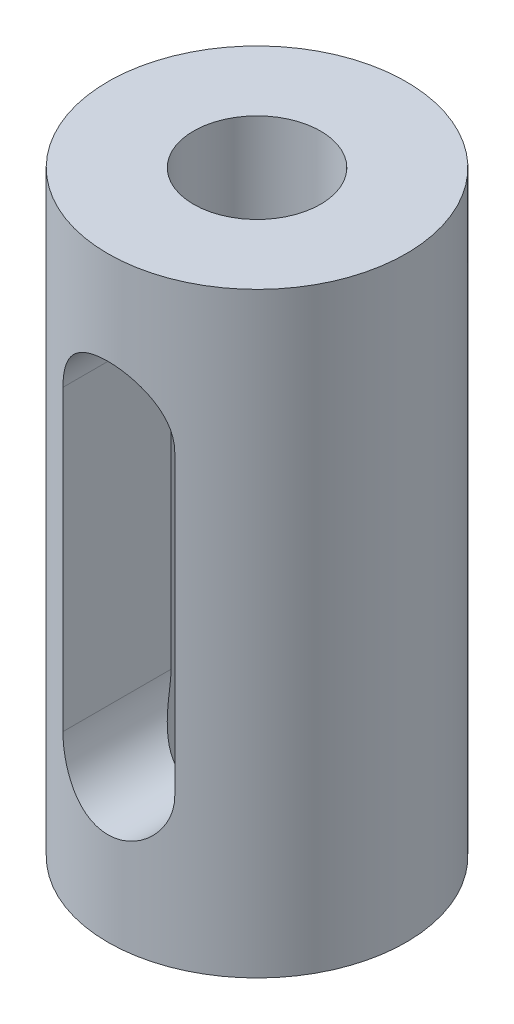
ISO-10303-21;
HEADER;
FILE_DESCRIPTION(('STEP AP214'),'2;1');
FILE_NAME('part.step','',(''),(''),'','','');
FILE_SCHEMA(('AUTOMOTIVE_DESIGN { 1 0 10303 214 1 1 1 1 }'));
ENDSEC;
DATA;
#1=APPLICATION_CONTEXT('core data for automotive mechanical design processes');
#2=APPLICATION_PROTOCOL_DEFINITION('international standard','automotive_design',2000,#1);
#3=PRODUCT_CONTEXT('',#1,'mechanical');
#4=PRODUCT('Part','Part','',(#3));
#5=PRODUCT_RELATED_PRODUCT_CATEGORY('part','',(#4));
#6=PRODUCT_DEFINITION_FORMATION('','',#4);
#7=PRODUCT_DEFINITION_CONTEXT('part definition',#1,'design');
#8=PRODUCT_DEFINITION('design','',#6,#7);
#9=PRODUCT_DEFINITION_SHAPE('','',#8);
#10=(LENGTH_UNIT() NAMED_UNIT(*) SI_UNIT(.MILLI.,.METRE.));
#11=(NAMED_UNIT(*) PLANE_ANGLE_UNIT() SI_UNIT($,.RADIAN.));
#12=(NAMED_UNIT(*) SI_UNIT($,.STERADIAN.) SOLID_ANGLE_UNIT());
#13=UNCERTAINTY_MEASURE_WITH_UNIT(LENGTH_MEASURE(1.E-05),#10,'distance_accuracy_value','');
#14=(GEOMETRIC_REPRESENTATION_CONTEXT(3) GLOBAL_UNCERTAINTY_ASSIGNED_CONTEXT((#13)) GLOBAL_UNIT_ASSIGNED_CONTEXT((#10,
#11,#12)) REPRESENTATION_CONTEXT('',''));
#15=CARTESIAN_POINT('',(0.,0.,0.));
#16=DIRECTION('',(0.,0.,1.));
#17=DIRECTION('',(1.,0.,0.));
#18=AXIS2_PLACEMENT_3D('',#15,#16,#17);
#19=CARTESIAN_POINT('',(0.,12.7,0.));
#20=DIRECTION('',(0.,-1.,0.));
#21=DIRECTION('',(0.,0.,-1.));
#22=AXIS2_PLACEMENT_3D('',#19,#20,#21);
#23=CYLINDRICAL_SURFACE('',#22,3.175);
#24=DIRECTION('',(0.,-1.,0.));
#25=VECTOR('',#24,1.);
#26=CARTESIAN_POINT('',(-1.190625,12.7,-2.94330377456609));
#27=LINE('',#26,#25);
#28=CARTESIAN_POINT('',(-1.190625,9.525,-2.94330377456609));
#29=VERTEX_POINT('',#28);
#30=CARTESIAN_POINT('',(-1.190625,3.175,-2.94330377456609));
#31=VERTEX_POINT('',#30);
#32=EDGE_CURVE('E166',#29,#31,#27,.T.);
#33=ORIENTED_EDGE('',*,*,#32,.T.);
#34=CARTESIAN_POINT('',(-1.190625,3.175,-2.94330377456609));
#35=CARTESIAN_POINT('',(-1.19062618848073,3.14277967690778,-2.94329995872857));
#36=CARTESIAN_POINT('',(-1.18931625076439,3.11057613112784,-2.94383351554502));
#37=CARTESIAN_POINT('',(-1.18409962328059,3.04642477238517,-2.94593703117006));
#38=CARTESIAN_POINT('',(-1.18019380538843,3.01447687720228,-2.94750664199916));
#39=CARTESIAN_POINT('',(-1.16466526629548,2.91959727251809,-2.95369436887438));
#40=CARTESIAN_POINT('',(-1.14923092772087,2.85734151969469,-2.95979205795841));
#41=CARTESIAN_POINT('',(-1.10879122478177,2.73655828217862,-2.97517516785815));
#42=CARTESIAN_POINT('',(-1.08379392479305,2.67802770444891,-2.98445790207025));
#43=CARTESIAN_POINT('',(-1.02500190069595,2.56592901845132,-3.00515645633822));
#44=CARTESIAN_POINT('',(-0.99119997623926,2.51236502065264,-3.01657402007336));
#45=CARTESIAN_POINT('',(-0.91397616823413,2.40911703854706,-3.04088474426552));
#46=CARTESIAN_POINT('',(-0.870190267274443,2.35971555113495,-3.05382115655563));
#47=CARTESIAN_POINT('',(-0.775013201823314,2.26875689804242,-3.07935139516824));
#48=CARTESIAN_POINT('',(-0.723620568591073,2.22720125080481,-3.09194515477271));
#49=CARTESIAN_POINT('',(-0.612531890043652,2.15174495493618,-3.11588859526652));
#50=CARTESIAN_POINT('',(-0.552612693952159,2.11815314820732,-3.1271813121393));
#51=CARTESIAN_POINT('',(-0.427476937704532,2.06164504557796,-3.14672690537256));
#52=CARTESIAN_POINT('',(-0.362262363264181,2.03872476946978,-3.15498091485232));
#53=CARTESIAN_POINT('',(-0.231370227719777,2.00520481068537,-3.16721085556145));
#54=CARTESIAN_POINT('',(-0.165833940311951,1.99411638870874,-3.17135594220028));
#55=CARTESIAN_POINT('',(-0.0337072593735775,1.98300879914146,-3.17550811124661));
#56=CARTESIAN_POINT('',(0.0328828035241819,1.98298622578848,-3.17551646682561));
#57=CARTESIAN_POINT('',(0.161721879430094,1.99372680869424,-3.17150165938149));
#58=CARTESIAN_POINT('',(0.224022668288449,2.00395639594589,-3.16767793539666));
#59=CARTESIAN_POINT('',(0.345948219071124,2.03401316519528,-3.15669026926481));
#60=CARTESIAN_POINT('',(0.405572828828377,2.05384089218802,-3.14952613744589));
#61=CARTESIAN_POINT('',(0.521484953024784,2.10277899912289,-3.13243730414583));
#62=CARTESIAN_POINT('',(0.577711250922169,2.13202031123296,-3.12247393335648));
#63=CARTESIAN_POINT('',(0.684598615222709,2.19883992982367,-3.10079480626558));
#64=CARTESIAN_POINT('',(0.735257863666696,2.23642094766869,-3.08907848045636));
#65=CARTESIAN_POINT('',(0.832712013169233,2.32141961062108,-3.06429285419527));
#66=CARTESIAN_POINT('',(0.879108122886126,2.36928373006591,-3.05118449980405));
#67=CARTESIAN_POINT('',(0.963372193449839,2.47220115666236,-3.02563755595115));
#68=CARTESIAN_POINT('',(1.00123680232957,2.5272572761264,-3.01319923119479));
#69=CARTESIAN_POINT('',(1.06813348661141,2.64458293505346,-2.99015045178193));
#70=CARTESIAN_POINT('',(1.09694552938089,2.70698785949868,-2.97958790430647));
#71=CARTESIAN_POINT('',(1.14346922163723,2.836232517962,-2.96204837787692));
#72=CARTESIAN_POINT('',(1.16119952777849,2.90306458766553,-2.95506537616461));
#73=CARTESIAN_POINT('',(1.17887172316472,3.00464618275791,-2.94803692564227));
#74=CARTESIAN_POINT('',(1.18327510053614,3.03855622405695,-2.94626884394537));
#75=CARTESIAN_POINT('',(1.18915107766906,3.10663754216694,-2.94390042682448));
#76=CARTESIAN_POINT('',(1.1906264013445,3.1408085464671,-2.94329900608927));
#77=CARTESIAN_POINT('',(1.190625,3.175,-2.94330377456609));
#78=B_SPLINE_CURVE_WITH_KNOTS('',3,(#34,#35,#36,#37,#38,#39,#40,#41,#42,#43,#44,#45,#46,#47,#48,
#49,#50,#51,#52,#53,#54,#55,#56,#57,#58,#59,#60,#61,#62,#63,#64,#65,#66,#67,#68,#69,#70,#71,#72,
#73,#74,#75,#76,#77),.UNSPECIFIED.,.F.,.F.,(4,2,2,2,2,2,2,2,2,2,2,2,2,2,2,2,2,2,2,2,2,4),(0.,
0.0965973633725355,0.193162299084219,0.38543949501938,0.577554901150598,0.769827913629831,
0.970740592641539,1.171692115472,1.37948621931291,1.58720275906571,1.78596071876867,
1.98465750622697,2.17352376479971,2.36240074870515,2.5540273495621,2.74571634263585,
2.94860657699107,3.151576387038,3.35915405166445,3.56638130093289,3.66897446974835,
3.77147215322594),.UNSPECIFIED.);
#79=CARTESIAN_POINT('',(1.190625,3.175,-2.94330377456609));
#80=VERTEX_POINT('',#79);
#81=EDGE_CURVE('E122',#31,#80,#78,.T.);
#82=ORIENTED_EDGE('',*,*,#81,.T.);
#83=DIRECTION('',(0.,-1.,0.));
#84=VECTOR('',#83,1.);
#85=CARTESIAN_POINT('',(1.190625,12.7,-2.94330377456609));
#86=LINE('',#85,#84);
#87=CARTESIAN_POINT('',(1.190625,9.525,-2.94330377456609));
#88=VERTEX_POINT('',#87);
#89=EDGE_CURVE('E172',#80,#88,#86,.F.);
#90=ORIENTED_EDGE('',*,*,#89,.T.);
#91=CARTESIAN_POINT('',(1.190625,9.525,-2.94330377456609));
#92=CARTESIAN_POINT('',(1.19062618848073,9.55722032309222,-2.94329995872857));
#93=CARTESIAN_POINT('',(1.18931625076439,9.58942386887216,-2.94383351554502));
#94=CARTESIAN_POINT('',(1.18409962328059,9.65357522761483,-2.94593703117006));
#95=CARTESIAN_POINT('',(1.18019380538843,9.68552312279772,-2.94750664199916));
#96=CARTESIAN_POINT('',(1.16466526629548,9.7804027274819,-2.95369436887438));
#97=CARTESIAN_POINT('',(1.14923092772087,9.84265848030531,-2.95979205795841));
#98=CARTESIAN_POINT('',(1.10879122478177,9.96344171782138,-2.97517516785815));
#99=CARTESIAN_POINT('',(1.08379392479305,10.0219722955511,-2.98445790207025));
#100=CARTESIAN_POINT('',(1.02500190069595,10.1340709815487,-3.00515645633822));
#101=CARTESIAN_POINT('',(0.99119997623926,10.1876349793474,-3.01657402007336));
#102=CARTESIAN_POINT('',(0.91397616823413,10.2908829614529,-3.04088474426552));
#103=CARTESIAN_POINT('',(0.870190267274443,10.3402844488651,-3.05382115655563));
#104=CARTESIAN_POINT('',(0.775013201823314,10.4312431019576,-3.07935139516824));
#105=CARTESIAN_POINT('',(0.723620568591073,10.4727987491952,-3.09194515477271));
#106=CARTESIAN_POINT('',(0.612531890043652,10.5482550450638,-3.11588859526652));
#107=CARTESIAN_POINT('',(0.55261269395216,10.5818468517927,-3.1271813121393));
#108=CARTESIAN_POINT('',(0.427476937704532,10.638354954422,-3.14672690537256));
#109=CARTESIAN_POINT('',(0.362262363264181,10.6612752305302,-3.15498091485232));
#110=CARTESIAN_POINT('',(0.231370227719777,10.6947951893146,-3.16721085556145));
#111=CARTESIAN_POINT('',(0.165833940311951,10.7058836112913,-3.17135594220028));
#112=CARTESIAN_POINT('',(0.0337072593735779,10.7169912008585,-3.17550811124661));
#113=CARTESIAN_POINT('',(-0.0328828035241814,10.7170137742115,-3.17551646682561));
#114=CARTESIAN_POINT('',(-0.161721879430094,10.7062731913058,-3.17150165938149));
#115=CARTESIAN_POINT('',(-0.224022668288449,10.6960436040541,-3.16767793539666));
#116=CARTESIAN_POINT('',(-0.345948219071124,10.6659868348047,-3.15669026926481));
#117=CARTESIAN_POINT('',(-0.405572828828377,10.646159107812,-3.14952613744589));
#118=CARTESIAN_POINT('',(-0.521484953024784,10.5972210008771,-3.13243730414583));
#119=CARTESIAN_POINT('',(-0.577711250922168,10.567979688767,-3.12247393335648));
#120=CARTESIAN_POINT('',(-0.684598615222709,10.5011600701763,-3.10079480626558));
#121=CARTESIAN_POINT('',(-0.735257863666696,10.4635790523313,-3.08907848045636));
#122=CARTESIAN_POINT('',(-0.832712013169232,10.3785803893789,-3.06429285419527));
#123=CARTESIAN_POINT('',(-0.879108122886125,10.3307162699341,-3.05118449980405));
#124=CARTESIAN_POINT('',(-0.963372193449838,10.2277988433376,-3.02563755595115));
#125=CARTESIAN_POINT('',(-1.00123680232957,10.1727427238736,-3.01319923119479));
#126=CARTESIAN_POINT('',(-1.06813348661141,10.0554170649465,-2.99015045178193));
#127=CARTESIAN_POINT('',(-1.09694552938089,9.99301214050132,-2.97958790430647));
#128=CARTESIAN_POINT('',(-1.14346922163723,9.86376748203799,-2.96204837787692));
#129=CARTESIAN_POINT('',(-1.16119952777849,9.79693541233447,-2.95506537616461));
#130=CARTESIAN_POINT('',(-1.17887172316472,9.69535381724209,-2.94803692564227));
#131=CARTESIAN_POINT('',(-1.18327510053614,9.66144377594305,-2.94626884394537));
#132=CARTESIAN_POINT('',(-1.18915107766906,9.59336245783306,-2.94390042682448));
#133=CARTESIAN_POINT('',(-1.1906264013445,9.5591914535329,-2.94329900608927));
#134=CARTESIAN_POINT('',(-1.190625,9.525,-2.94330377456609));
#135=B_SPLINE_CURVE_WITH_KNOTS('',3,(#91,#92,#93,#94,#95,#96,#97,#98,#99,#100,#101,#102,#103,
#104,#105,#106,#107,#108,#109,#110,#111,#112,#113,#114,#115,#116,#117,#118,#119,#120,#121,#122,
#123,#124,#125,#126,#127,#128,#129,#130,#131,#132,#133,#134),.UNSPECIFIED.,.F.,.F.,(4,2,2,2,2,2,
2,2,2,2,2,2,2,2,2,2,2,2,2,2,2,4),(0.,0.0965973633725364,0.193162299084221,0.385439495019381,
0.577554901150601,0.769827913629833,0.970740592641542,1.171692115472,1.37948621931292,
1.58720275906572,1.78596071876867,1.98465750622697,2.17352376479971,2.36240074870515,
2.5540273495621,2.74571634263585,2.94860657699107,3.151576387038,3.35915405166445,
3.5663813009329,3.66897446974835,3.77147215322594),.UNSPECIFIED.);
#136=EDGE_CURVE('E178',#88,#29,#135,.T.);
#137=ORIENTED_EDGE('',*,*,#136,.T.);
#138=EDGE_LOOP('',(#33,#82,#90,#137));
#139=FACE_BOUND('',#138,.T.);
#140=DIRECTION('',(0.,-1.,0.));
#141=VECTOR('',#140,1.);
#142=CARTESIAN_POINT('',(1.190625,12.7,2.94330377456609));
#143=LINE('',#142,#141);
#144=CARTESIAN_POINT('',(1.190625,9.525,2.94330377456609));
#145=VERTEX_POINT('',#144);
#146=CARTESIAN_POINT('',(1.190625,3.175,2.94330377456609));
#147=VERTEX_POINT('',#146);
#148=EDGE_CURVE('E175',#145,#147,#143,.T.);
#149=ORIENTED_EDGE('',*,*,#148,.T.);
#150=CARTESIAN_POINT('',(1.190625,3.175,2.94330377456609));
#151=CARTESIAN_POINT('',(1.19062618848074,3.14277967690778,2.94329995872857));
#152=CARTESIAN_POINT('',(1.18931625076439,3.11057613112784,2.94383351554502));
#153=CARTESIAN_POINT('',(1.18409962328059,3.04642477238517,2.94593703117006));
#154=CARTESIAN_POINT('',(1.18019380538843,3.01447687720228,2.94750664199915));
#155=CARTESIAN_POINT('',(1.16466526629548,2.91959727251809,2.95369436887438));
#156=CARTESIAN_POINT('',(1.14923092772087,2.85734151969469,2.95979205795841));
#157=CARTESIAN_POINT('',(1.10879122478177,2.73655828217862,2.97517516785815));
#158=CARTESIAN_POINT('',(1.08379392479306,2.67802770444891,2.98445790207025));
#159=CARTESIAN_POINT('',(1.02500190069595,2.56592901845132,3.00515645633822));
#160=CARTESIAN_POINT('',(0.991199976239262,2.51236502065264,3.01657402007336));
#161=CARTESIAN_POINT('',(0.913976168234132,2.40911703854706,3.04088474426551));
#162=CARTESIAN_POINT('',(0.870190267274445,2.35971555113495,3.05382115655563));
#163=CARTESIAN_POINT('',(0.775013201823316,2.26875689804242,3.07935139516824));
#164=CARTESIAN_POINT('',(0.723620568591075,2.22720125080481,3.09194515477271));
#165=CARTESIAN_POINT('',(0.612531890043654,2.15174495493618,3.11588859526652));
#166=CARTESIAN_POINT('',(0.552612693952161,2.11815314820732,3.1271813121393));
#167=CARTESIAN_POINT('',(0.427476937704534,2.06164504557796,3.14672690537256));
#168=CARTESIAN_POINT('',(0.362262363264183,2.03872476946978,3.15498091485232));
#169=CARTESIAN_POINT('',(0.231370227719779,2.00520481068537,3.16721085556145));
#170=CARTESIAN_POINT('',(0.165833940311953,1.99411638870874,3.17135594220028));
#171=CARTESIAN_POINT('',(0.0337072593735796,1.98300879914146,3.17550811124661));
#172=CARTESIAN_POINT('',(-0.0328828035241797,1.98298622578848,3.17551646682561));
#173=CARTESIAN_POINT('',(-0.161721879430092,1.99372680869424,3.17150165938149));
#174=CARTESIAN_POINT('',(-0.224022668288447,2.00395639594589,3.16767793539666));
#175=CARTESIAN_POINT('',(-0.345948219071122,2.03401316519528,3.15669026926481));
#176=CARTESIAN_POINT('',(-0.405572828828375,2.05384089218802,3.14952613744589));
#177=CARTESIAN_POINT('',(-0.521484953024782,2.10277899912289,3.13243730414583));
#178=CARTESIAN_POINT('',(-0.577711250922167,2.13202031123295,3.12247393335648));
#179=CARTESIAN_POINT('',(-0.684598615222707,2.19883992982367,3.10079480626558));
#180=CARTESIAN_POINT('',(-0.735257863666694,2.23642094766869,3.08907848045636));
#181=CARTESIAN_POINT('',(-0.832712013169231,2.32141961062108,3.06429285419527));
#182=CARTESIAN_POINT('',(-0.879108122886124,2.36928373006591,3.05118449980405));
#183=CARTESIAN_POINT('',(-0.963372193449837,2.47220115666236,3.02563755595115));
#184=CARTESIAN_POINT('',(-1.00123680232957,2.5272572761264,3.01319923119479));
#185=CARTESIAN_POINT('',(-1.06813348661141,2.64458293505346,2.99015045178193));
#186=CARTESIAN_POINT('',(-1.09694552938088,2.70698785949867,2.97958790430647));
#187=CARTESIAN_POINT('',(-1.14346922163722,2.836232517962,2.96204837787692));
#188=CARTESIAN_POINT('',(-1.16119952777849,2.90306458766553,2.95506537616461));
#189=CARTESIAN_POINT('',(-1.17887172316472,3.00464618275791,2.94803692564228));
#190=CARTESIAN_POINT('',(-1.18327510053614,3.03855622405695,2.94626884394537));
#191=CARTESIAN_POINT('',(-1.18915107766906,3.10663754216694,2.94390042682448));
#192=CARTESIAN_POINT('',(-1.1906264013445,3.1408085464671,2.94329900608927));
#193=CARTESIAN_POINT('',(-1.190625,3.175,2.94330377456609));
#194=B_SPLINE_CURVE_WITH_KNOTS('',3,(#150,#151,#152,#153,#154,#155,#156,#157,#158,#159,#160,
#161,#162,#163,#164,#165,#166,#167,#168,#169,#170,#171,#172,#173,#174,#175,#176,#177,#178,#179,
#180,#181,#182,#183,#184,#185,#186,#187,#188,#189,#190,#191,#192,#193),.UNSPECIFIED.,.F.,.F.,(4,
2,2,2,2,2,2,2,2,2,2,2,2,2,2,2,2,2,2,2,2,4),(0.,0.0965973633725351,0.193162299084219,
0.38543949501938,0.577554901150599,0.769827913629831,0.970740592641539,1.171692115472,
1.37948621931291,1.58720275906572,1.78596071876867,1.98465750622697,2.17352376479971,
2.36240074870515,2.5540273495621,2.74571634263585,2.94860657699107,3.151576387038,
3.35915405166445,3.56638130093289,3.66897446974835,3.77147215322594),.UNSPECIFIED.);
#195=CARTESIAN_POINT('',(-1.190625,3.175,2.94330377456609));
#196=VERTEX_POINT('',#195);
#197=EDGE_CURVE('E165',#147,#196,#194,.T.);
#198=ORIENTED_EDGE('',*,*,#197,.T.);
#199=DIRECTION('',(0.,-1.,0.));
#200=VECTOR('',#199,1.);
#201=CARTESIAN_POINT('',(-1.190625,12.7,2.94330377456609));
#202=LINE('',#201,#200);
#203=CARTESIAN_POINT('',(-1.190625,9.525,2.94330377456609));
#204=VERTEX_POINT('',#203);
#205=EDGE_CURVE('E217',#196,#204,#202,.F.);
#206=ORIENTED_EDGE('',*,*,#205,.T.);
#207=CARTESIAN_POINT('',(-1.190625,9.525,2.94330377456609));
#208=CARTESIAN_POINT('',(-1.19062618848074,9.55722032309222,2.94329995872857));
#209=CARTESIAN_POINT('',(-1.18931625076439,9.58942386887216,2.94383351554502));
#210=CARTESIAN_POINT('',(-1.18409962328059,9.65357522761483,2.94593703117006));
#211=CARTESIAN_POINT('',(-1.18019380538843,9.68552312279772,2.94750664199915));
#212=CARTESIAN_POINT('',(-1.16466526629548,9.7804027274819,2.95369436887438));
#213=CARTESIAN_POINT('',(-1.14923092772087,9.84265848030531,2.95979205795841));
#214=CARTESIAN_POINT('',(-1.10879122478177,9.96344171782138,2.97517516785815));
#215=CARTESIAN_POINT('',(-1.08379392479306,10.0219722955511,2.98445790207025));
#216=CARTESIAN_POINT('',(-1.02500190069595,10.1340709815487,3.00515645633822));
#217=CARTESIAN_POINT('',(-0.991199976239262,10.1876349793474,3.01657402007336));
#218=CARTESIAN_POINT('',(-0.913976168234133,10.2908829614529,3.04088474426551));
#219=CARTESIAN_POINT('',(-0.870190267274446,10.340284448865,3.05382115655563));
#220=CARTESIAN_POINT('',(-0.775013201823316,10.4312431019576,3.07935139516824));
#221=CARTESIAN_POINT('',(-0.723620568591075,10.4727987491952,3.09194515477271));
#222=CARTESIAN_POINT('',(-0.612531890043652,10.5482550450638,3.11588859526652));
#223=CARTESIAN_POINT('',(-0.55261269395216,10.5818468517927,3.1271813121393));
#224=CARTESIAN_POINT('',(-0.427476937704533,10.638354954422,3.14672690537256));
#225=CARTESIAN_POINT('',(-0.362262363264182,10.6612752305302,3.15498091485232));
#226=CARTESIAN_POINT('',(-0.231370227719778,10.6947951893146,3.16721085556145));
#227=CARTESIAN_POINT('',(-0.165833940311952,10.7058836112913,3.17135594220028));
#228=CARTESIAN_POINT('',(-0.0337072593735791,10.7169912008585,3.17550811124661));
#229=CARTESIAN_POINT('',(0.0328828035241802,10.7170137742115,3.17551646682561));
#230=CARTESIAN_POINT('',(0.161721879430093,10.7062731913058,3.17150165938149));
#231=CARTESIAN_POINT('',(0.224022668288447,10.6960436040541,3.16767793539666));
#232=CARTESIAN_POINT('',(0.345948219071122,10.6659868348047,3.15669026926481));
#233=CARTESIAN_POINT('',(0.405572828828375,10.646159107812,3.14952613744589));
#234=CARTESIAN_POINT('',(0.521484953024783,10.5972210008771,3.13243730414583));
#235=CARTESIAN_POINT('',(0.577711250922167,10.567979688767,3.12247393335648));
#236=CARTESIAN_POINT('',(0.684598615222707,10.5011600701763,3.10079480626558));
#237=CARTESIAN_POINT('',(0.735257863666694,10.4635790523313,3.08907848045636));
#238=CARTESIAN_POINT('',(0.832712013169231,10.3785803893789,3.06429285419527));
#239=CARTESIAN_POINT('',(0.879108122886124,10.3307162699341,3.05118449980405));
#240=CARTESIAN_POINT('',(0.963372193449837,10.2277988433376,3.02563755595115));
#241=CARTESIAN_POINT('',(1.00123680232957,10.1727427238736,3.01319923119479));
#242=CARTESIAN_POINT('',(1.06813348661141,10.0554170649465,2.99015045178193));
#243=CARTESIAN_POINT('',(1.09694552938088,9.99301214050132,2.97958790430647));
#244=CARTESIAN_POINT('',(1.14346922163723,9.86376748203799,2.96204837787692));
#245=CARTESIAN_POINT('',(1.16119952777849,9.79693541233447,2.95506537616461));
#246=CARTESIAN_POINT('',(1.17887172316472,9.69535381724209,2.94803692564228));
#247=CARTESIAN_POINT('',(1.18327510053614,9.66144377594305,2.94626884394537));
#248=CARTESIAN_POINT('',(1.18915107766906,9.59336245783306,2.94390042682448));
#249=CARTESIAN_POINT('',(1.1906264013445,9.5591914535329,2.94329900608927));
#250=CARTESIAN_POINT('',(1.190625,9.525,2.94330377456609));
#251=B_SPLINE_CURVE_WITH_KNOTS('',3,(#207,#208,#209,#210,#211,#212,#213,#214,#215,#216,#217,
#218,#219,#220,#221,#222,#223,#224,#225,#226,#227,#228,#229,#230,#231,#232,#233,#234,#235,#236,
#237,#238,#239,#240,#241,#242,#243,#244,#245,#246,#247,#248,#249,#250),.UNSPECIFIED.,.F.,.F.,(4,
2,2,2,2,2,2,2,2,2,2,2,2,2,2,2,2,2,2,2,2,4),(0.,0.0965973633725364,0.193162299084221,
0.385439495019381,0.577554901150599,0.769827913629831,0.970740592641539,1.171692115472,
1.37948621931292,1.58720275906572,1.78596071876867,1.98465750622697,2.17352376479971,
2.36240074870515,2.5540273495621,2.74571634263585,2.94860657699107,3.151576387038,
3.35915405166445,3.5663813009329,3.66897446974835,3.77147215322594),.UNSPECIFIED.);
#252=EDGE_CURVE('E183',#204,#145,#251,.T.);
#253=ORIENTED_EDGE('',*,*,#252,.T.);
#254=EDGE_LOOP('',(#149,#198,#206,#253));
#255=FACE_BOUND('',#254,.T.);
#256=CARTESIAN_POINT('',(0.,12.7,0.));
#257=DIRECTION('',(0.,1.,0.));
#258=DIRECTION('',(0.,0.,1.));
#259=AXIS2_PLACEMENT_3D('',#256,#257,#258);
#260=CIRCLE('',#259,3.175);
#261=CARTESIAN_POINT('',(0.,12.7,3.175));
#262=VERTEX_POINT('',#261);
#263=EDGE_CURVE('E116',#262,#262,#260,.T.);
#264=ORIENTED_EDGE('',*,*,#263,.F.);
#265=EDGE_LOOP('',(#264));
#266=FACE_BOUND('',#265,.T.);
#267=CARTESIAN_POINT('',(0.,0.,0.));
#268=DIRECTION('',(0.,1.,0.));
#269=DIRECTION('',(0.,0.,1.));
#270=AXIS2_PLACEMENT_3D('',#267,#268,#269);
#271=CIRCLE('',#270,3.175);
#272=CARTESIAN_POINT('',(0.,0.,3.175));
#273=VERTEX_POINT('',#272);
#274=EDGE_CURVE('E230',#273,#273,#271,.T.);
#275=ORIENTED_EDGE('',*,*,#274,.T.);
#276=EDGE_LOOP('',(#275));
#277=FACE_BOUND('',#276,.T.);
#278=ADVANCED_FACE('F37',(#139,#255,#266,#277),#23,.T.);
#279=CARTESIAN_POINT('',(0.,12.7,0.));
#280=DIRECTION('',(0.,1.,0.));
#281=DIRECTION('',(0.,0.,1.));
#282=AXIS2_PLACEMENT_3D('',#279,#280,#281);
#283=PLANE('',#282);
#284=CARTESIAN_POINT('',(0.,12.7,0.));
#285=DIRECTION('',(0.,1.,0.));
#286=DIRECTION('',(0.,0.,1.));
#287=AXIS2_PLACEMENT_3D('',#284,#285,#286);
#288=CIRCLE('',#287,1.35254999999999);
#289=CARTESIAN_POINT('',(0.,12.7,1.35254999999999));
#290=VERTEX_POINT('',#289);
#291=EDGE_CURVE('E224',#290,#290,#288,.T.);
#292=ORIENTED_EDGE('',*,*,#291,.F.);
#293=EDGE_LOOP('',(#292));
#294=FACE_BOUND('',#293,.T.);
#295=ORIENTED_EDGE('',*,*,#263,.T.);
#296=EDGE_LOOP('',(#295));
#297=FACE_BOUND('',#296,.T.);
#298=ADVANCED_FACE('F240',(#294,#297),#283,.T.);
#299=CARTESIAN_POINT('',(0.,0.,0.));
#300=DIRECTION('',(0.,1.,0.));
#301=DIRECTION('',(0.,0.,1.));
#302=AXIS2_PLACEMENT_3D('',#299,#300,#301);
#303=PLANE('',#302);
#304=CARTESIAN_POINT('',(0.,0.,0.));
#305=DIRECTION('',(0.,1.,0.));
#306=DIRECTION('',(0.,0.,1.));
#307=AXIS2_PLACEMENT_3D('',#304,#305,#306);
#308=CIRCLE('',#307,1.35255);
#309=CARTESIAN_POINT('',(0.,0.,1.35255));
#310=VERTEX_POINT('',#309);
#311=EDGE_CURVE('E226',#310,#310,#308,.T.);
#312=ORIENTED_EDGE('',*,*,#311,.T.);
#313=EDGE_LOOP('',(#312));
#314=FACE_BOUND('',#313,.T.);
#315=ORIENTED_EDGE('',*,*,#274,.F.);
#316=EDGE_LOOP('',(#315));
#317=FACE_BOUND('',#316,.T.);
#318=ADVANCED_FACE('F238',(#314,#317),#303,.F.);
#319=CARTESIAN_POINT('',(0.,12.7,0.));
#320=DIRECTION('',(0.,1.,0.));
#321=DIRECTION('',(0.,0.,1.));
#322=AXIS2_PLACEMENT_3D('',#319,#320,#321);
#323=CYLINDRICAL_SURFACE('',#322,1.35255);
#324=DIRECTION('',(0.,1.,0.));
#325=VECTOR('',#324,1.);
#326=CARTESIAN_POINT('',(1.190625,12.7,0.641719262508918));
#327=LINE('',#326,#325);
#328=CARTESIAN_POINT('',(1.190625,3.175,0.641719262508915));
#329=VERTEX_POINT('',#328);
#330=CARTESIAN_POINT('',(1.190625,9.525,0.641719262508918));
#331=VERTEX_POINT('',#330);
#332=EDGE_CURVE('E50',#329,#331,#327,.T.);
#333=ORIENTED_EDGE('',*,*,#332,.T.);
#334=CARTESIAN_POINT('',(1.190625,9.525,0.641719262508917));
#335=CARTESIAN_POINT('',(1.19066571986986,9.56334607020842,0.641557283796457));
#336=CARTESIAN_POINT('',(1.18877671130534,9.60140752659745,0.645159975697118));
#337=CARTESIAN_POINT('',(1.18163354304275,9.67554670988399,0.658189685094699));
#338=CARTESIAN_POINT('',(1.17643868152506,9.71164746325981,0.667513969199228));
#339=CARTESIAN_POINT('',(1.16007943597601,9.79805249196192,0.695670267302344));
#340=CARTESIAN_POINT('',(1.14726605696047,9.84721514491697,0.716904554229078));
#341=CARTESIAN_POINT('',(1.11637320142791,9.94189860709206,0.76414357870234));
#342=CARTESIAN_POINT('',(1.09824091278728,9.98737675413773,0.790195139104776));
#343=CARTESIAN_POINT('',(1.06119209954145,10.0662624578364,0.839055412831134));
#344=CARTESIAN_POINT('',(1.04311725574554,10.1002949960382,0.861506509468477));
#345=CARTESIAN_POINT('',(1.00392780188969,10.1662402880759,0.906874826696303));
#346=CARTESIAN_POINT('',(0.982811517166426,10.198151859835,0.929792298070681));
#347=CARTESIAN_POINT('',(0.9150270510806,10.2906020786765,0.99810307377894));
#348=CARTESIAN_POINT('',(0.863794173154386,10.3481293691352,1.04323591236457));
#349=CARTESIAN_POINT('',(0.762372803561189,10.4414875095907,1.11857217043411));
#350=CARTESIAN_POINT('',(0.714714855916175,10.4792522043281,1.14980592809482));
#351=CARTESIAN_POINT('',(0.612166951629825,10.5480530997483,1.20751261864862));
#352=CARTESIAN_POINT('',(0.557287251332536,10.5790986805797,1.23399217966486));
#353=CARTESIAN_POINT('',(0.451951626487714,10.6277358945948,1.27581697055307));
#354=CARTESIAN_POINT('',(0.402622303022453,10.6467615900354,1.29232087308629));
#355=CARTESIAN_POINT('',(0.300453887999346,10.6783286148771,1.31981424758843));
#356=CARTESIAN_POINT('',(0.247617087213402,10.6908741304374,1.33080727941271));
#357=CARTESIAN_POINT('',(0.139488819454767,10.7087004350055,1.34645159576843));
#358=CARTESIAN_POINT('',(0.0841856260710264,10.7139415817757,1.35106827337483));
#359=CARTESIAN_POINT('',(-0.0267534649621894,10.7166157291265,1.35342198508186));
#360=CARTESIAN_POINT('',(-0.082389284944256,10.7140504864761,1.35116056704597));
#361=CARTESIAN_POINT('',(-0.187253125075297,10.7018884104612,1.34047111972752));
#362=CARTESIAN_POINT('',(-0.236615609029979,10.6929270581348,1.33260048883759));
#363=CARTESIAN_POINT('',(-0.332832274421573,10.6692322511512,1.31188341527577));
#364=CARTESIAN_POINT('',(-0.379685762116851,10.6544972093309,1.29903560440888));
#365=CARTESIAN_POINT('',(-0.473016886813023,10.6188471403327,1.26815628184314));
#366=CARTESIAN_POINT('',(-0.519267325167169,10.5975895212218,1.24983951796619));
#367=CARTESIAN_POINT('',(-0.607409329365308,10.5502549155659,1.2094623600228));
#368=CARTESIAN_POINT('',(-0.649300358954844,10.5241773372063,1.18740150626882));
#369=CARTESIAN_POINT('',(-0.749085284207008,10.4533872121695,1.1283384220489));
#370=CARTESIAN_POINT('',(-0.804024248150758,10.4060202306588,1.08951718440938));
#371=CARTESIAN_POINT('',(-0.903663359292782,10.3035444443044,1.00842683014317));
#372=CARTESIAN_POINT('',(-0.948309652641229,10.2483972491252,0.966141080616886));
#373=CARTESIAN_POINT('',(-1.00796250555843,10.1597457841608,0.902375127553331));
#374=CARTESIAN_POINT('',(-1.02680119161744,10.1288123171476,0.880811645922078));
#375=CARTESIAN_POINT('',(-1.06176912097473,10.0649645912261,0.838327690813683));
#376=CARTESIAN_POINT('',(-1.0778960706015,10.0320486871501,0.817407773780586));
#377=CARTESIAN_POINT('',(-1.10723467378814,9.96428911285122,0.777198657913558));
#378=CARTESIAN_POINT('',(-1.12046352565989,9.92945843973347,0.75790028249424));
#379=CARTESIAN_POINT('',(-1.14388589922635,9.85747660369727,0.72206177672509));
#380=CARTESIAN_POINT('',(-1.15408580578303,9.82033052456283,0.705515877169906));
#381=CARTESIAN_POINT('',(-1.1699906069883,9.7483647851253,0.678766995607847));
#382=CARTESIAN_POINT('',(-1.17609979404043,9.71384119627207,0.668027652887393));
#383=CARTESIAN_POINT('',(-1.18526074727091,9.64328760285962,0.651647431829503));
#384=CARTESIAN_POINT('',(-1.18832649424939,9.60726528625811,0.645983251279203));
#385=CARTESIAN_POINT('',(-1.19033103214479,9.55569249179808,0.642261050132441));
#386=CARTESIAN_POINT('',(-1.190631067271,9.54034670128189,0.641698834812889));
#387=CARTESIAN_POINT('',(-1.19062500000002,9.52499999999969,0.641719262513175));
#388=B_SPLINE_CURVE_WITH_KNOTS('',3,(#334,#335,#336,#337,#338,#339,#340,#341,#342,#343,#344,
#345,#346,#347,#348,#349,#350,#351,#352,#353,#354,#355,#356,#357,#358,#359,#360,#361,#362,#363,
#364,#365,#366,#367,#368,#369,#370,#371,#372,#373,#374,#375,#376,#377,#378,#379,#380,#381,#382,
#383,#384,#385,#386,#387),.UNSPECIFIED.,.F.,.F.,(4,2,2,2,2,2,2,2,2,2,2,2,2,2,2,2,2,2,2,2,2,2,2,
2,2,2,4),(0.,0.114373028930709,0.226750212329603,0.391034858731896,0.557009360758274,
0.69063416576809,0.824332829896231,1.09068518166131,1.29506494995732,1.49915752879066,
1.66464740081118,1.83003023319679,1.99630718071365,2.16254671162803,2.31422746765066,
2.46594994936578,2.62764669660429,2.7893633108394,3.03487301904939,3.28163953049276,
3.40798723023035,3.5344412670139,3.66012323224913,3.78553835441611,3.89516064083094,
4.00427698687415,4.05030898369704),.UNSPECIFIED.);
#389=CARTESIAN_POINT('',(-1.190625,9.525,0.641719262508914));
#390=VERTEX_POINT('',#389);
#391=EDGE_CURVE('E11',#331,#390,#388,.T.);
#392=ORIENTED_EDGE('',*,*,#391,.T.);
#393=DIRECTION('',(0.,1.,0.));
#394=VECTOR('',#393,1.);
#395=CARTESIAN_POINT('',(-1.190625,12.7,0.641719262508914));
#396=LINE('',#395,#394);
#397=CARTESIAN_POINT('',(-1.190625,3.175,0.641719262508914));
#398=VERTEX_POINT('',#397);
#399=EDGE_CURVE('E199',#390,#398,#396,.F.);
#400=ORIENTED_EDGE('',*,*,#399,.T.);
#401=CARTESIAN_POINT('',(-1.190625,3.175,0.641719262508918));
#402=CARTESIAN_POINT('',(-1.19066571986986,3.13665392979157,0.641557283796459));
#403=CARTESIAN_POINT('',(-1.18877671130534,3.09859247340255,0.64515997569712));
#404=CARTESIAN_POINT('',(-1.18163354304275,3.02445329011601,0.6581896850947));
#405=CARTESIAN_POINT('',(-1.17643868152506,2.98835253674019,0.66751396919923));
#406=CARTESIAN_POINT('',(-1.16007943597601,2.90194750803808,0.695670267302345));
#407=CARTESIAN_POINT('',(-1.14726605696047,2.85278485508303,0.716904554229079));
#408=CARTESIAN_POINT('',(-1.11637320142791,2.75810139290794,0.764143578702341));
#409=CARTESIAN_POINT('',(-1.09824091278728,2.71262324586227,0.790195139104777));
#410=CARTESIAN_POINT('',(-1.06119209954145,2.63373754216355,0.839055412831136));
#411=CARTESIAN_POINT('',(-1.04311725574554,2.59970500396175,0.861506509468478));
#412=CARTESIAN_POINT('',(-1.00392780188969,2.53375971192414,0.906874826696304));
#413=CARTESIAN_POINT('',(-0.982811517166425,2.50184814016502,0.929792298070682));
#414=CARTESIAN_POINT('',(-0.915027051080599,2.40939792132347,0.998103073778941));
#415=CARTESIAN_POINT('',(-0.863794173154385,2.35187063086481,1.04323591236457));
#416=CARTESIAN_POINT('',(-0.762372803561188,2.25851249040926,1.11857217043411));
#417=CARTESIAN_POINT('',(-0.714714855916174,2.22074779567193,1.14980592809482));
#418=CARTESIAN_POINT('',(-0.612166951629823,2.15194690025171,1.20751261864862));
#419=CARTESIAN_POINT('',(-0.557287251332534,2.12090131942027,1.23399217966486));
#420=CARTESIAN_POINT('',(-0.451951626487711,2.07226410540515,1.27581697055307));
#421=CARTESIAN_POINT('',(-0.402622303022451,2.05323840996457,1.29232087308629));
#422=CARTESIAN_POINT('',(-0.300453887999344,2.02167138512288,1.31981424758843));
#423=CARTESIAN_POINT('',(-0.247617087213401,2.00912586956257,1.33080727941271));
#424=CARTESIAN_POINT('',(-0.139488819454766,1.99129956499449,1.34645159576843));
#425=CARTESIAN_POINT('',(-0.0841856260710254,1.98605841822433,1.35106827337483));
#426=CARTESIAN_POINT('',(0.0267534649621903,1.98338427087349,1.35342198508186));
#427=CARTESIAN_POINT('',(0.0823892849442571,1.98594951352389,1.35116056704597));
#428=CARTESIAN_POINT('',(0.187253125075298,1.99811158953879,1.34047111972752));
#429=CARTESIAN_POINT('',(0.23661560902998,2.00707294186522,1.33260048883759));
#430=CARTESIAN_POINT('',(0.332832274421574,2.03076774884878,1.31188341527577));
#431=CARTESIAN_POINT('',(0.379685762116852,2.04550279066906,1.29903560440888));
#432=CARTESIAN_POINT('',(0.473016886813024,2.08115285966733,1.26815628184314));
#433=CARTESIAN_POINT('',(0.519267325167171,2.10241047877815,1.24983951796619));
#434=CARTESIAN_POINT('',(0.60740932936531,2.14974508443413,1.2094623600228));
#435=CARTESIAN_POINT('',(0.649300358954845,2.17582266279372,1.18740150626882));
#436=CARTESIAN_POINT('',(0.749085284207008,2.24661278783045,1.1283384220489));
#437=CARTESIAN_POINT('',(0.804024248150759,2.29397976934116,1.08951718440938));
#438=CARTESIAN_POINT('',(0.903663359292783,2.39645555569557,1.00842683014317));
#439=CARTESIAN_POINT('',(0.94830965264123,2.45160275087477,0.966141080616885));
#440=CARTESIAN_POINT('',(1.00796250555843,2.54025421583924,0.90237512755333));
#441=CARTESIAN_POINT('',(1.02680119161744,2.57118768285237,0.880811645922078));
#442=CARTESIAN_POINT('',(1.06176912097473,2.63503540877389,0.838327690813683));
#443=CARTESIAN_POINT('',(1.0778960706015,2.66795131284993,0.817407773780585));
#444=CARTESIAN_POINT('',(1.10723467378814,2.73571088714877,0.777198657913557));
#445=CARTESIAN_POINT('',(1.12046352565989,2.77054156026653,0.757900282494239));
#446=CARTESIAN_POINT('',(1.14388589922635,2.84252339630273,0.722061776725089));
#447=CARTESIAN_POINT('',(1.15408580578303,2.87966947543717,0.705515877169905));
#448=CARTESIAN_POINT('',(1.1699906069883,2.9516352148747,0.678766995607846));
#449=CARTESIAN_POINT('',(1.17609979404043,2.98615880372793,0.668027652887392));
#450=CARTESIAN_POINT('',(1.18526074727091,3.05671239714038,0.651647431829503));
#451=CARTESIAN_POINT('',(1.18832649424939,3.09273471374188,0.645983251279202));
#452=CARTESIAN_POINT('',(1.19033103214479,3.14430750820192,0.64226105013244));
#453=CARTESIAN_POINT('',(1.190631067271,3.15965329871811,0.641698834812889));
#454=CARTESIAN_POINT('',(1.19062500000002,3.1750000000003,0.641719262513175));
#455=B_SPLINE_CURVE_WITH_KNOTS('',3,(#401,#402,#403,#404,#405,#406,#407,#408,#409,#410,#411,
#412,#413,#414,#415,#416,#417,#418,#419,#420,#421,#422,#423,#424,#425,#426,#427,#428,#429,#430,
#431,#432,#433,#434,#435,#436,#437,#438,#439,#440,#441,#442,#443,#444,#445,#446,#447,#448,#449,
#450,#451,#452,#453,#454),.UNSPECIFIED.,.F.,.F.,(4,2,2,2,2,2,2,2,2,2,2,2,2,2,2,2,2,2,2,2,2,2,2,
2,2,2,4),(0.,0.114373028930709,0.226750212329603,0.391034858731895,0.557009360758274,
0.690634165768091,0.824332829896231,1.09068518166131,1.29506494995732,1.49915752879066,
1.66464740081118,1.83003023319679,1.99630718071365,2.16254671162803,2.31422746765066,
2.46594994936578,2.62764669660429,2.7893633108394,3.03487301904939,3.28163953049276,
3.40798723023035,3.5344412670139,3.66012323224913,3.78553835441611,3.89516064083094,
4.00427698687415,4.05030898369704),.UNSPECIFIED.);
#456=EDGE_CURVE('E155',#398,#329,#455,.T.);
#457=ORIENTED_EDGE('',*,*,#456,.T.);
#458=EDGE_LOOP('',(#333,#392,#400,#457));
#459=FACE_BOUND('',#458,.T.);
#460=DIRECTION('',(0.,1.,0.));
#461=VECTOR('',#460,1.);
#462=CARTESIAN_POINT('',(-1.190625,12.7,-0.641719262508914));
#463=LINE('',#462,#461);
#464=CARTESIAN_POINT('',(-1.190625,3.175,-0.641719262508914));
#465=VERTEX_POINT('',#464);
#466=CARTESIAN_POINT('',(-1.190625,9.525,-0.641719262508914));
#467=VERTEX_POINT('',#466);
#468=EDGE_CURVE('E107',#465,#467,#463,.T.);
#469=ORIENTED_EDGE('',*,*,#468,.T.);
#470=CARTESIAN_POINT('',(-1.190625,9.525,-0.641719262508915));
#471=CARTESIAN_POINT('',(-1.19066571986986,9.56334607020842,-0.641557283796456));
#472=CARTESIAN_POINT('',(-1.18877671130535,9.60140752659745,-0.645159975697117));
#473=CARTESIAN_POINT('',(-1.18163354304275,9.67554670988399,-0.658189685094697));
#474=CARTESIAN_POINT('',(-1.17643868152506,9.71164746325981,-0.667513969199227));
#475=CARTESIAN_POINT('',(-1.16007943597601,9.79805249196192,-0.695670267302342));
#476=CARTESIAN_POINT('',(-1.14726605696047,9.84721514491697,-0.716904554229075));
#477=CARTESIAN_POINT('',(-1.11637320142792,9.94189860709205,-0.764143578702337));
#478=CARTESIAN_POINT('',(-1.09824091278728,9.98737675413772,-0.790195139104773));
#479=CARTESIAN_POINT('',(-1.06119209954145,10.0662624578364,-0.839055412831132));
#480=CARTESIAN_POINT('',(-1.04311725574554,10.1002949960382,-0.861506509468474));
#481=CARTESIAN_POINT('',(-1.00392780188969,10.1662402880759,-0.906874826696301));
#482=CARTESIAN_POINT('',(-0.982811517166428,10.198151859835,-0.929792298070678));
#483=CARTESIAN_POINT('',(-0.915027051080604,10.2906020786765,-0.998103073778937));
#484=CARTESIAN_POINT('',(-0.86379417315439,10.3481293691352,-1.04323591236457));
#485=CARTESIAN_POINT('',(-0.762372803561193,10.4414875095907,-1.11857217043411));
#486=CARTESIAN_POINT('',(-0.714714855916178,10.4792522043281,-1.14980592809482));
#487=CARTESIAN_POINT('',(-0.612166951629827,10.5480530997483,-1.20751261864862));
#488=CARTESIAN_POINT('',(-0.557287251332538,10.5790986805797,-1.23399217966486));
#489=CARTESIAN_POINT('',(-0.451951626487715,10.6277358945948,-1.27581697055307));
#490=CARTESIAN_POINT('',(-0.402622303022455,10.6467615900354,-1.29232087308629));
#491=CARTESIAN_POINT('',(-0.300453887999348,10.6783286148771,-1.31981424758843));
#492=CARTESIAN_POINT('',(-0.247617087213404,10.6908741304374,-1.33080727941271));
#493=CARTESIAN_POINT('',(-0.139488819454769,10.7087004350055,-1.34645159576843));
#494=CARTESIAN_POINT('',(-0.0841856260710282,10.7139415817757,-1.35106827337483));
#495=CARTESIAN_POINT('',(0.0267534649621879,10.7166157291265,-1.35342198508186));
#496=CARTESIAN_POINT('',(0.0823892849442547,10.7140504864761,-1.35116056704597));
#497=CARTESIAN_POINT('',(0.187253125075296,10.7018884104612,-1.34047111972752));
#498=CARTESIAN_POINT('',(0.236615609029977,10.6929270581348,-1.33260048883759));
#499=CARTESIAN_POINT('',(0.332832274421572,10.6692322511512,-1.31188341527577));
#500=CARTESIAN_POINT('',(0.37968576211685,10.6544972093309,-1.29903560440888));
#501=CARTESIAN_POINT('',(0.473016886813022,10.6188471403327,-1.26815628184314));
#502=CARTESIAN_POINT('',(0.519267325167168,10.5975895212218,-1.2498395179662));
#503=CARTESIAN_POINT('',(0.607409329365307,10.5502549155659,-1.2094623600228));
#504=CARTESIAN_POINT('',(0.649300358954842,10.5241773372063,-1.18740150626882));
#505=CARTESIAN_POINT('',(0.749085284207006,10.4533872121695,-1.1283384220489));
#506=CARTESIAN_POINT('',(0.804024248150757,10.4060202306588,-1.08951718440938));
#507=CARTESIAN_POINT('',(0.90366335929278,10.3035444443044,-1.00842683014318));
#508=CARTESIAN_POINT('',(0.948309652641228,10.2483972491252,-0.966141080616887));
#509=CARTESIAN_POINT('',(1.00796250555843,10.1597457841608,-0.902375127553333));
#510=CARTESIAN_POINT('',(1.02680119161743,10.1288123171476,-0.88081164592208));
#511=CARTESIAN_POINT('',(1.06176912097472,10.0649645912261,-0.838327690813685));
#512=CARTESIAN_POINT('',(1.0778960706015,10.0320486871501,-0.817407773780587));
#513=CARTESIAN_POINT('',(1.10723467378814,9.96428911285123,-0.777198657913559));
#514=CARTESIAN_POINT('',(1.12046352565989,9.92945843973347,-0.757900282494241));
#515=CARTESIAN_POINT('',(1.14388589922635,9.85747660369727,-0.722061776725092));
#516=CARTESIAN_POINT('',(1.15408580578302,9.82033052456283,-0.705515877169908));
#517=CARTESIAN_POINT('',(1.1699906069883,9.7483647851253,-0.678766995607849));
#518=CARTESIAN_POINT('',(1.17609979404043,9.71384119627207,-0.668027652887394));
#519=CARTESIAN_POINT('',(1.18526074727091,9.64328760285962,-0.651647431829505));
#520=CARTESIAN_POINT('',(1.18832649424939,9.60726528625812,-0.645983251279205));
#521=CARTESIAN_POINT('',(1.19033103214479,9.55569249179808,-0.642261050132443));
#522=CARTESIAN_POINT('',(1.190631067271,9.54034670128189,-0.641698834812891));
#523=CARTESIAN_POINT('',(1.19062500000001,9.52499999999969,-0.641719262513177));
#524=B_SPLINE_CURVE_WITH_KNOTS('',3,(#470,#471,#472,#473,#474,#475,#476,#477,#478,#479,#480,
#481,#482,#483,#484,#485,#486,#487,#488,#489,#490,#491,#492,#493,#494,#495,#496,#497,#498,#499,
#500,#501,#502,#503,#504,#505,#506,#507,#508,#509,#510,#511,#512,#513,#514,#515,#516,#517,#518,
#519,#520,#521,#522,#523),.UNSPECIFIED.,.F.,.F.,(4,2,2,2,2,2,2,2,2,2,2,2,2,2,2,2,2,2,2,2,2,2,2,
2,2,2,4),(0.,0.114373028930709,0.226750212329601,0.39103485873189,0.557009360758271,
0.690634165768088,0.824332829896227,1.0906851816613,1.29506494995732,1.49915752879066,
1.66464740081118,1.83003023319679,1.99630718071365,2.16254671162803,2.31422746765066,
2.46594994936578,2.62764669660429,2.7893633108394,3.03487301904939,3.28163953049276,
3.40798723023035,3.5344412670139,3.66012323224913,3.7855383544161,3.89516064083094,
4.00427698687415,4.05030898369704),.UNSPECIFIED.);
#525=CARTESIAN_POINT('',(1.190625,9.525,-0.641719262508918));
#526=VERTEX_POINT('',#525);
#527=EDGE_CURVE('E132',#467,#526,#524,.T.);
#528=ORIENTED_EDGE('',*,*,#527,.T.);
#529=DIRECTION('',(0.,1.,0.));
#530=VECTOR('',#529,1.);
#531=CARTESIAN_POINT('',(1.190625,12.7,-0.641719262508918));
#532=LINE('',#531,#530);
#533=CARTESIAN_POINT('',(1.190625,3.175,-0.641719262508915));
#534=VERTEX_POINT('',#533);
#535=EDGE_CURVE('E130',#526,#534,#532,.F.);
#536=ORIENTED_EDGE('',*,*,#535,.T.);
#537=CARTESIAN_POINT('',(1.190625,3.175,-0.641719262508915));
#538=CARTESIAN_POINT('',(1.19066571986986,3.13665392979157,-0.641557283796455));
#539=CARTESIAN_POINT('',(1.18877671130535,3.09859247340255,-0.645159975697116));
#540=CARTESIAN_POINT('',(1.18163354304275,3.02445329011601,-0.658189685094697));
#541=CARTESIAN_POINT('',(1.17643868152506,2.98835253674019,-0.667513969199227));
#542=CARTESIAN_POINT('',(1.16007943597601,2.90194750803808,-0.695670267302342));
#543=CARTESIAN_POINT('',(1.14726605696047,2.85278485508303,-0.716904554229075));
#544=CARTESIAN_POINT('',(1.11637320142791,2.75810139290794,-0.764143578702338));
#545=CARTESIAN_POINT('',(1.09824091278728,2.71262324586228,-0.790195139104774));
#546=CARTESIAN_POINT('',(1.06119209954145,2.63373754216355,-0.839055412831133));
#547=CARTESIAN_POINT('',(1.04311725574554,2.59970500396175,-0.861506509468475));
#548=CARTESIAN_POINT('',(1.00392780188969,2.53375971192414,-0.906874826696301));
#549=CARTESIAN_POINT('',(0.982811517166427,2.50184814016502,-0.929792298070679));
#550=CARTESIAN_POINT('',(0.915027051080602,2.40939792132347,-0.998103073778939));
#551=CARTESIAN_POINT('',(0.863794173154388,2.35187063086481,-1.04323591236457));
#552=CARTESIAN_POINT('',(0.762372803561191,2.25851249040926,-1.11857217043411));
#553=CARTESIAN_POINT('',(0.714714855916176,2.22074779567193,-1.14980592809482));
#554=CARTESIAN_POINT('',(0.612166951629825,2.15194690025171,-1.20751261864862));
#555=CARTESIAN_POINT('',(0.557287251332537,2.12090131942027,-1.23399217966486));
#556=CARTESIAN_POINT('',(0.451951626487714,2.07226410540515,-1.27581697055307));
#557=CARTESIAN_POINT('',(0.402622303022453,2.05323840996457,-1.29232087308629));
#558=CARTESIAN_POINT('',(0.300453887999347,2.02167138512288,-1.31981424758843));
#559=CARTESIAN_POINT('',(0.247617087213403,2.00912586956257,-1.33080727941271));
#560=CARTESIAN_POINT('',(0.139488819454768,1.99129956499449,-1.34645159576843));
#561=CARTESIAN_POINT('',(0.0841856260710278,1.98605841822433,-1.35106827337483));
#562=CARTESIAN_POINT('',(-0.0267534649621881,1.98338427087349,-1.35342198508186));
#563=CARTESIAN_POINT('',(-0.0823892849442548,1.98594951352389,-1.35116056704597));
#564=CARTESIAN_POINT('',(-0.187253125075296,1.99811158953879,-1.34047111972752));
#565=CARTESIAN_POINT('',(-0.236615609029978,2.00707294186522,-1.33260048883759));
#566=CARTESIAN_POINT('',(-0.332832274421572,2.03076774884878,-1.31188341527577));
#567=CARTESIAN_POINT('',(-0.37968576211685,2.04550279066906,-1.29903560440888));
#568=CARTESIAN_POINT('',(-0.473016886813022,2.08115285966733,-1.26815628184314));
#569=CARTESIAN_POINT('',(-0.519267325167168,2.10241047877815,-1.2498395179662));
#570=CARTESIAN_POINT('',(-0.607409329365307,2.14974508443413,-1.2094623600228));
#571=CARTESIAN_POINT('',(-0.649300358954843,2.17582266279372,-1.18740150626882));
#572=CARTESIAN_POINT('',(-0.749085284207007,2.24661278783045,-1.1283384220489));
#573=CARTESIAN_POINT('',(-0.804024248150757,2.29397976934116,-1.08951718440938));
#574=CARTESIAN_POINT('',(-0.903663359292781,2.39645555569557,-1.00842683014318));
#575=CARTESIAN_POINT('',(-0.948309652641228,2.45160275087477,-0.966141080616887));
#576=CARTESIAN_POINT('',(-1.00796250555843,2.54025421583924,-0.902375127553333));
#577=CARTESIAN_POINT('',(-1.02680119161743,2.57118768285237,-0.88081164592208));
#578=CARTESIAN_POINT('',(-1.06176912097472,2.63503540877389,-0.838327690813685));
#579=CARTESIAN_POINT('',(-1.0778960706015,2.66795131284993,-0.817407773780588));
#580=CARTESIAN_POINT('',(-1.10723467378814,2.73571088714877,-0.777198657913559));
#581=CARTESIAN_POINT('',(-1.12046352565989,2.77054156026653,-0.757900282494241));
#582=CARTESIAN_POINT('',(-1.14388589922635,2.84252339630273,-0.722061776725092));
#583=CARTESIAN_POINT('',(-1.15408580578302,2.87966947543717,-0.705515877169909));
#584=CARTESIAN_POINT('',(-1.1699906069883,2.9516352148747,-0.678766995607849));
#585=CARTESIAN_POINT('',(-1.17609979404043,2.98615880372793,-0.668027652887395));
#586=CARTESIAN_POINT('',(-1.18526074727091,3.05671239714038,-0.651647431829505));
#587=CARTESIAN_POINT('',(-1.18832649424939,3.09273471374188,-0.645983251279205));
#588=CARTESIAN_POINT('',(-1.19033103214479,3.14430750820192,-0.642261050132443));
#589=CARTESIAN_POINT('',(-1.19063106727099,3.15965329871811,-0.641698834812892));
#590=CARTESIAN_POINT('',(-1.19062500000001,3.1750000000003,-0.641719262513179));
#591=B_SPLINE_CURVE_WITH_KNOTS('',3,(#537,#538,#539,#540,#541,#542,#543,#544,#545,#546,#547,
#548,#549,#550,#551,#552,#553,#554,#555,#556,#557,#558,#559,#560,#561,#562,#563,#564,#565,#566,
#567,#568,#569,#570,#571,#572,#573,#574,#575,#576,#577,#578,#579,#580,#581,#582,#583,#584,#585,
#586,#587,#588,#589,#590),.UNSPECIFIED.,.F.,.F.,(4,2,2,2,2,2,2,2,2,2,2,2,2,2,2,2,2,2,2,2,2,2,2,
2,2,2,4),(0.,0.114373028930709,0.226750212329602,0.391034858731893,0.557009360758273,
0.69063416576809,0.82433282989623,1.09068518166131,1.29506494995732,1.49915752879066,
1.66464740081119,1.8300302331968,1.99630718071365,2.16254671162803,2.31422746765066,
2.46594994936578,2.62764669660429,2.7893633108394,3.03487301904939,3.28163953049276,
3.40798723023035,3.5344412670139,3.66012323224913,3.78553835441611,3.89516064083094,
4.00427698687415,4.05030898369704),.UNSPECIFIED.);
#592=EDGE_CURVE('E115',#534,#465,#591,.T.);
#593=ORIENTED_EDGE('',*,*,#592,.T.);
#594=EDGE_LOOP('',(#469,#528,#536,#593));
#595=FACE_BOUND('',#594,.T.);
#596=ORIENTED_EDGE('',*,*,#311,.F.);
#597=EDGE_LOOP('',(#596));
#598=FACE_BOUND('',#597,.T.);
#599=ORIENTED_EDGE('',*,*,#291,.T.);
#600=EDGE_LOOP('',(#599));
#601=FACE_BOUND('',#600,.T.);
#602=ADVANCED_FACE('F128',(#459,#595,#598,#601),#323,.F.);
#603=CARTESIAN_POINT('',(-1.190625,9.525,-3.175));
#604=DIRECTION('',(-1.,0.,0.));
#605=DIRECTION('',(0.,-1.,0.));
#606=AXIS2_PLACEMENT_3D('',#603,#604,#605);
#607=PLANE('',#606);
#608=DIRECTION('',(0.,0.,1.));
#609=VECTOR('',#608,1.);
#610=CARTESIAN_POINT('',(-1.190625,9.525,-3.175));
#611=LINE('',#610,#609);
#612=EDGE_CURVE('E110',#29,#467,#611,.T.);
#613=ORIENTED_EDGE('',*,*,#612,.T.);
#614=ORIENTED_EDGE('',*,*,#468,.F.);
#615=DIRECTION('',(0.,0.,1.));
#616=VECTOR('',#615,1.);
#617=CARTESIAN_POINT('',(-1.190625,3.175,-3.175));
#618=LINE('',#617,#616);
#619=EDGE_CURVE('E57',#31,#465,#618,.T.);
#620=ORIENTED_EDGE('',*,*,#619,.F.);
#621=ORIENTED_EDGE('',*,*,#32,.F.);
#622=EDGE_LOOP('',(#613,#614,#620,#621));
#623=FACE_BOUND('',#622,.T.);
#624=ADVANCED_FACE('F108',(#623),#607,.F.);
#625=CARTESIAN_POINT('',(0.,3.175,-3.175));
#626=DIRECTION('',(0.,0.,1.));
#627=DIRECTION('',(1.,0.,0.));
#628=AXIS2_PLACEMENT_3D('',#625,#626,#627);
#629=CYLINDRICAL_SURFACE('',#628,1.190625);
#630=ORIENTED_EDGE('',*,*,#619,.T.);
#631=ORIENTED_EDGE('',*,*,#592,.F.);
#632=DIRECTION('',(0.,0.,1.));
#633=VECTOR('',#632,1.);
#634=CARTESIAN_POINT('',(1.190625,3.175,-3.175));
#635=LINE('',#634,#633);
#636=EDGE_CURVE('E213',#80,#534,#635,.T.);
#637=ORIENTED_EDGE('',*,*,#636,.F.);
#638=ORIENTED_EDGE('',*,*,#81,.F.);
#639=EDGE_LOOP('',(#630,#631,#637,#638));
#640=FACE_BOUND('',#639,.T.);
#641=ADVANCED_FACE('F119',(#640),#629,.F.);
#642=CARTESIAN_POINT('',(1.190625,9.525,-3.175));
#643=DIRECTION('',(1.,0.,0.));
#644=DIRECTION('',(0.,1.,0.));
#645=AXIS2_PLACEMENT_3D('',#642,#643,#644);
#646=PLANE('',#645);
#647=ORIENTED_EDGE('',*,*,#636,.T.);
#648=ORIENTED_EDGE('',*,*,#535,.F.);
#649=DIRECTION('',(0.,0.,1.));
#650=VECTOR('',#649,1.);
#651=CARTESIAN_POINT('',(1.190625,9.525,-3.175));
#652=LINE('',#651,#650);
#653=EDGE_CURVE('E219',#88,#526,#652,.T.);
#654=ORIENTED_EDGE('',*,*,#653,.F.);
#655=ORIENTED_EDGE('',*,*,#89,.F.);
#656=EDGE_LOOP('',(#647,#648,#654,#655));
#657=FACE_BOUND('',#656,.T.);
#658=ADVANCED_FACE('F261',(#657),#646,.F.);
#659=CARTESIAN_POINT('',(0.,9.525,-3.175));
#660=DIRECTION('',(0.,0.,1.));
#661=DIRECTION('',(1.,0.,0.));
#662=AXIS2_PLACEMENT_3D('',#659,#660,#661);
#663=CYLINDRICAL_SURFACE('',#662,1.190625);
#664=ORIENTED_EDGE('',*,*,#653,.T.);
#665=ORIENTED_EDGE('',*,*,#527,.F.);
#666=ORIENTED_EDGE('',*,*,#612,.F.);
#667=ORIENTED_EDGE('',*,*,#136,.F.);
#668=EDGE_LOOP('',(#664,#665,#666,#667));
#669=FACE_BOUND('',#668,.T.);
#670=ADVANCED_FACE('F191',(#669),#663,.F.);
#671=EDGE_CURVE('E65',#390,#204,#611,.T.);
#672=ORIENTED_EDGE('',*,*,#671,.F.);
#673=ORIENTED_EDGE('',*,*,#391,.F.);
#674=EDGE_CURVE('E211',#331,#145,#652,.T.);
#675=ORIENTED_EDGE('',*,*,#674,.T.);
#676=ORIENTED_EDGE('',*,*,#252,.F.);
#677=EDGE_LOOP('',(#672,#673,#675,#676));
#678=FACE_BOUND('',#677,.T.);
#679=ADVANCED_FACE('F188',(#678),#663,.F.);
#680=ORIENTED_EDGE('',*,*,#674,.F.);
#681=ORIENTED_EDGE('',*,*,#332,.F.);
#682=EDGE_CURVE('E124',#329,#147,#635,.T.);
#683=ORIENTED_EDGE('',*,*,#682,.T.);
#684=ORIENTED_EDGE('',*,*,#148,.F.);
#685=EDGE_LOOP('',(#680,#681,#683,#684));
#686=FACE_BOUND('',#685,.T.);
#687=ADVANCED_FACE('F148',(#686),#646,.F.);
#688=ORIENTED_EDGE('',*,*,#682,.F.);
#689=ORIENTED_EDGE('',*,*,#456,.F.);
#690=EDGE_CURVE('E125',#398,#196,#618,.T.);
#691=ORIENTED_EDGE('',*,*,#690,.T.);
#692=ORIENTED_EDGE('',*,*,#197,.F.);
#693=EDGE_LOOP('',(#688,#689,#691,#692));
#694=FACE_BOUND('',#693,.T.);
#695=ADVANCED_FACE('F142',(#694),#629,.F.);
#696=ORIENTED_EDGE('',*,*,#690,.F.);
#697=ORIENTED_EDGE('',*,*,#399,.F.);
#698=ORIENTED_EDGE('',*,*,#671,.T.);
#699=ORIENTED_EDGE('',*,*,#205,.F.);
#700=EDGE_LOOP('',(#696,#697,#698,#699));
#701=FACE_BOUND('',#700,.T.);
#702=ADVANCED_FACE('F147',(#701),#607,.F.);
#703=CLOSED_SHELL('',(#278,#298,#318,#602,#624,#641,#658,#670,#679,#687,#695,#702));
#704=MANIFOLD_SOLID_BREP('B2',#703);
#705=ADVANCED_BREP_SHAPE_REPRESENTATION('',(#18,#704),#14);
#706=SHAPE_DEFINITION_REPRESENTATION(#9,#705);
ENDSEC;
END-ISO-10303-21;
